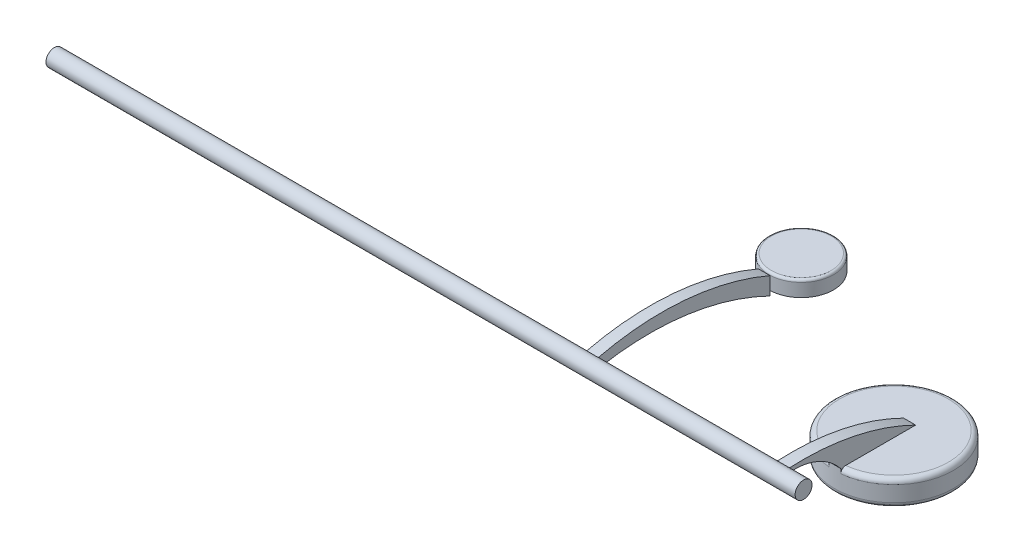
ISO-10303-21;
HEADER;
FILE_DESCRIPTION(('STEP AP214'),'2;1');
FILE_NAME('part.step','',(''),(''),'','','');
FILE_SCHEMA(('AUTOMOTIVE_DESIGN { 1 0 10303 214 1 1 1 1 }'));
ENDSEC;
DATA;
#1=APPLICATION_CONTEXT('core data for automotive mechanical design processes');
#2=APPLICATION_PROTOCOL_DEFINITION('international standard','automotive_design',2000,#1);
#3=PRODUCT_CONTEXT('',#1,'mechanical');
#4=PRODUCT('Part','Part','',(#3));
#5=PRODUCT_RELATED_PRODUCT_CATEGORY('part','',(#4));
#6=PRODUCT_DEFINITION_FORMATION('','',#4);
#7=PRODUCT_DEFINITION_CONTEXT('part definition',#1,'design');
#8=PRODUCT_DEFINITION('design','',#6,#7);
#9=PRODUCT_DEFINITION_SHAPE('','',#8);
#10=(LENGTH_UNIT() NAMED_UNIT(*) SI_UNIT(.MILLI.,.METRE.));
#11=(NAMED_UNIT(*) PLANE_ANGLE_UNIT() SI_UNIT($,.RADIAN.));
#12=(NAMED_UNIT(*) SI_UNIT($,.STERADIAN.) SOLID_ANGLE_UNIT());
#13=UNCERTAINTY_MEASURE_WITH_UNIT(LENGTH_MEASURE(1.E-05),#10,'distance_accuracy_value','');
#14=(GEOMETRIC_REPRESENTATION_CONTEXT(3) GLOBAL_UNCERTAINTY_ASSIGNED_CONTEXT((#13)) GLOBAL_UNIT_ASSIGNED_CONTEXT((#10,
#11,#12)) REPRESENTATION_CONTEXT('',''));
#15=CARTESIAN_POINT('',(0.,0.,0.));
#16=DIRECTION('',(0.,0.,1.));
#17=DIRECTION('',(1.,0.,0.));
#18=AXIS2_PLACEMENT_3D('',#15,#16,#17);
#19=CARTESIAN_POINT('',(140.0302,-6.80720000000001,-56.2092159368474));
#20=DIRECTION('',(0.,-1.,0.));
#21=DIRECTION('',(0.,0.,-1.));
#22=AXIS2_PLACEMENT_3D('',#19,#20,#21);
#23=CYLINDRICAL_SURFACE('',#22,8.4836);
#24=CARTESIAN_POINT('',(140.0302,-3.34367027846591,-56.2092159368474));
#25=DIRECTION('',(0.,1.,0.));
#26=DIRECTION('',(0.,0.,1.));
#27=AXIS2_PLACEMENT_3D('',#24,#25,#26);
#28=CIRCLE('',#27,8.4836);
#29=CARTESIAN_POINT('',(140.0302,-3.34367027846591,-47.7256159368473));
#30=VERTEX_POINT('',#29);
#31=EDGE_CURVE('E54',#30,#30,#28,.F.);
#32=ORIENTED_EDGE('',*,*,#31,.T.);
#33=EDGE_LOOP('',(#32));
#34=FACE_BOUND('',#33,.T.);
#35=CARTESIAN_POINT('',(140.0302,-6.80720000000001,-56.2092159368474));
#36=DIRECTION('',(0.,-1.,0.));
#37=DIRECTION('',(0.,0.,-1.));
#38=AXIS2_PLACEMENT_3D('',#35,#36,#37);
#39=CIRCLE('',#38,8.4836);
#40=CARTESIAN_POINT('',(140.0302,-6.80720000000001,-64.6928159368474));
#41=VERTEX_POINT('',#40);
#42=EDGE_CURVE('E58',#41,#41,#39,.T.);
#43=ORIENTED_EDGE('',*,*,#42,.F.);
#44=EDGE_LOOP('',(#43));
#45=FACE_BOUND('',#44,.T.);
#46=ADVANCED_FACE('F47',(#34,#45),#23,.T.);
#47=CARTESIAN_POINT('',(140.0302,-2.70867027846591,-47.7256159368473));
#48=DIRECTION('',(0.,1.,0.));
#49=DIRECTION('',(0.,0.,1.));
#50=AXIS2_PLACEMENT_3D('',#47,#48,#49);
#51=PLANE('',#50);
#52=CARTESIAN_POINT('',(140.0302,-2.70867027846591,-56.2092159368474));
#53=DIRECTION('',(0.,1.,0.));
#54=DIRECTION('',(0.,0.,1.));
#55=AXIS2_PLACEMENT_3D('',#52,#53,#54);
#56=CIRCLE('',#55,7.8486);
#57=CARTESIAN_POINT('',(140.0302,-2.70867027846591,-48.3606159368473));
#58=VERTEX_POINT('',#57);
#59=EDGE_CURVE('E11',#58,#58,#56,.T.);
#60=ORIENTED_EDGE('',*,*,#59,.T.);
#61=EDGE_LOOP('',(#60));
#62=FACE_BOUND('',#61,.T.);
#63=ADVANCED_FACE('F68',(#62),#51,.T.);
#64=CARTESIAN_POINT('',(140.0302,-6.80720000000001,-47.7256159368473));
#65=DIRECTION('',(0.,-1.,0.));
#66=DIRECTION('',(0.,0.,-1.));
#67=AXIS2_PLACEMENT_3D('',#64,#65,#66);
#68=PLANE('',#67);
#69=ORIENTED_EDGE('',*,*,#42,.T.);
#70=EDGE_LOOP('',(#69));
#71=FACE_BOUND('',#70,.T.);
#72=ADVANCED_FACE('F65',(#71),#68,.T.);
#73=CARTESIAN_POINT('',(140.0302,-3.34367027846591,-56.2092159368474));
#74=DIRECTION('',(0.,1.,0.));
#75=DIRECTION('',(0.,0.,1.));
#76=AXIS2_PLACEMENT_3D('',#73,#74,#75);
#77=TOROIDAL_SURFACE('',#76,7.8486,0.635);
#78=ORIENTED_EDGE('',*,*,#59,.F.);
#79=EDGE_LOOP('',(#78));
#80=FACE_BOUND('',#79,.T.);
#81=ORIENTED_EDGE('',*,*,#31,.F.);
#82=EDGE_LOOP('',(#81));
#83=FACE_BOUND('',#82,.T.);
#84=ADVANCED_FACE('F49',(#80,#83),#77,.T.);
#85=CLOSED_SHELL('',(#46,#63,#72,#84));
#86=MANIFOLD_SOLID_BREP('B2',#85);
#87=CARTESIAN_POINT('',(188.1378,-5.5372,-15.24));
#88=DIRECTION('',(0.,-1.,0.));
#89=DIRECTION('',(0.,0.,-1.));
#90=AXIS2_PLACEMENT_3D('',#87,#88,#89);
#91=PLANE('',#90);
#92=DIRECTION('',(0.,0.,-1.));
#93=VECTOR('',#92,1.);
#94=CARTESIAN_POINT('',(188.1378,-5.5372,-15.24));
#95=LINE('',#94,#93);
#96=CARTESIAN_POINT('',(188.1378,-5.5372,-15.24));
#97=VERTEX_POINT('',#96);
#98=CARTESIAN_POINT('',(188.1378,-5.5372,-15.3208750085464));
#99=VERTEX_POINT('',#98);
#100=EDGE_CURVE('E236',#97,#99,#95,.T.);
#101=ORIENTED_EDGE('',*,*,#100,.T.);
#102=CARTESIAN_POINT('',(189.7253,-5.5372,-30.861));
#103=DIRECTION('',(0.,-1.,0.));
#104=DIRECTION('',(0.,0.,-1.));
#105=AXIS2_PLACEMENT_3D('',#102,#103,#104);
#106=CIRCLE('',#105,15.621);
#107=CARTESIAN_POINT('',(189.7253,-5.5372,-15.24));
#108=VERTEX_POINT('',#107);
#109=EDGE_CURVE('E204',#108,#99,#106,.T.);
#110=ORIENTED_EDGE('',*,*,#109,.F.);
#111=DIRECTION('',(1.,0.,0.));
#112=VECTOR('',#111,1.);
#113=CARTESIAN_POINT('',(188.1378,-5.5372,-15.24));
#114=LINE('',#113,#112);
#115=EDGE_CURVE('E262',#97,#108,#114,.T.);
#116=ORIENTED_EDGE('',*,*,#115,.F.);
#117=EDGE_LOOP('',(#101,#110,#116));
#118=FACE_BOUND('',#117,.T.);
#119=ADVANCED_FACE('F103',(#118),#91,.T.);
#120=CARTESIAN_POINT('',(196.85,0.,0.));
#121=DIRECTION('',(-1.,0.,0.));
#122=DIRECTION('',(0.,0.,1.));
#123=AXIS2_PLACEMENT_3D('',#120,#121,#122);
#124=CYLINDRICAL_SURFACE('',#123,2.2225);
#125=DIRECTION('',(1.,0.,0.));
#126=VECTOR('',#125,1.);
#127=CARTESIAN_POINT('',(140.0302,1.76515248022416,-1.35046028137022));
#128=LINE('',#127,#126);
#129=CARTESIAN_POINT('',(138.5062,1.76515248022414,-1.35046028137022));
#130=VERTEX_POINT('',#129);
#131=CARTESIAN_POINT('',(141.5542,1.76515248022417,-1.35046028137027));
#132=VERTEX_POINT('',#131);
#133=EDGE_CURVE('E122',#130,#132,#128,.T.);
#134=ORIENTED_EDGE('',*,*,#133,.F.);
#135=CARTESIAN_POINT('',(138.5062,0.,0.));
#136=DIRECTION('',(-1.,0.,0.));
#137=DIRECTION('',(0.,0.,1.));
#138=AXIS2_PLACEMENT_3D('',#135,#136,#137);
#139=CIRCLE('',#138,2.2225);
#140=CARTESIAN_POINT('',(138.5062,-0.617883716154621,-2.13488312638208));
#141=VERTEX_POINT('',#140);
#142=EDGE_CURVE('E45',#130,#141,#139,.T.);
#143=ORIENTED_EDGE('',*,*,#142,.T.);
#144=DIRECTION('',(1.,0.,0.));
#145=VECTOR('',#144,1.);
#146=CARTESIAN_POINT('',(140.0302,-0.617883716154621,-2.13488312638209));
#147=LINE('',#146,#145);
#148=CARTESIAN_POINT('',(141.5542,-0.617883716154635,-2.13488312638203));
#149=VERTEX_POINT('',#148);
#150=EDGE_CURVE('E112',#149,#141,#147,.F.);
#151=ORIENTED_EDGE('',*,*,#150,.F.);
#152=CARTESIAN_POINT('',(141.5542,0.,0.));
#153=DIRECTION('',(-1.,0.,0.));
#154=DIRECTION('',(0.,0.,1.));
#155=AXIS2_PLACEMENT_3D('',#152,#153,#154);
#156=CIRCLE('',#155,2.2225);
#157=EDGE_CURVE('E380',#132,#149,#156,.T.);
#158=ORIENTED_EDGE('',*,*,#157,.F.);
#159=EDGE_LOOP('',(#134,#143,#151,#158));
#160=FACE_BOUND('',#159,.T.);
#161=DIRECTION('',(1.,0.,0.));
#162=VECTOR('',#161,1.);
#163=CARTESIAN_POINT('',(189.7253,1.29557688585347,-1.80582025208553));
#164=LINE('',#163,#162);
#165=CARTESIAN_POINT('',(191.3128,1.29557688585345,-1.80582025208543));
#166=VERTEX_POINT('',#165);
#167=CARTESIAN_POINT('',(188.1378,1.29557688585345,-1.80582025208553));
#168=VERTEX_POINT('',#167);
#169=EDGE_CURVE('E277',#166,#168,#164,.F.);
#170=ORIENTED_EDGE('',*,*,#169,.T.);
#171=CARTESIAN_POINT('',(188.1378,0.,0.));
#172=DIRECTION('',(-1.,0.,0.));
#173=DIRECTION('',(0.,0.,1.));
#174=AXIS2_PLACEMENT_3D('',#171,#172,#173);
#175=CIRCLE('',#174,2.2225);
#176=CARTESIAN_POINT('',(188.1378,0.290668192770734,-2.20341059535244));
#177=VERTEX_POINT('',#176);
#178=EDGE_CURVE('E283',#168,#177,#175,.T.);
#179=ORIENTED_EDGE('',*,*,#178,.T.);
#180=DIRECTION('',(1.,0.,0.));
#181=VECTOR('',#180,1.);
#182=CARTESIAN_POINT('',(189.7253,0.290668192770736,-2.20341059535244));
#183=LINE('',#182,#181);
#184=CARTESIAN_POINT('',(191.3128,0.290668192770734,-2.20341059535245));
#185=VERTEX_POINT('',#184);
#186=EDGE_CURVE('E280',#177,#185,#183,.T.);
#187=ORIENTED_EDGE('',*,*,#186,.T.);
#188=CARTESIAN_POINT('',(191.3128,0.,0.));
#189=DIRECTION('',(-1.,0.,0.));
#190=DIRECTION('',(0.,0.,1.));
#191=AXIS2_PLACEMENT_3D('',#188,#189,#190);
#192=CIRCLE('',#191,2.2225);
#193=EDGE_CURVE('E270',#166,#185,#192,.T.);
#194=ORIENTED_EDGE('',*,*,#193,.F.);
#195=EDGE_LOOP('',(#170,#179,#187,#194));
#196=FACE_BOUND('',#195,.T.);
#197=CARTESIAN_POINT('',(196.85,0.,0.));
#198=DIRECTION('',(1.,0.,0.));
#199=DIRECTION('',(0.,0.,-1.));
#200=AXIS2_PLACEMENT_3D('',#197,#198,#199);
#201=CIRCLE('',#200,2.2225);
#202=CARTESIAN_POINT('',(196.85,0.,-2.2225));
#203=VERTEX_POINT('',#202);
#204=EDGE_CURVE('E266',#203,#203,#201,.T.);
#205=ORIENTED_EDGE('',*,*,#204,.F.);
#206=EDGE_LOOP('',(#205));
#207=FACE_BOUND('',#206,.T.);
#208=CARTESIAN_POINT('',(0.,0.,0.));
#209=DIRECTION('',(1.,0.,0.));
#210=DIRECTION('',(0.,0.,-1.));
#211=AXIS2_PLACEMENT_3D('',#208,#209,#210);
#212=CIRCLE('',#211,2.2225);
#213=CARTESIAN_POINT('',(0.,0.,-2.2225));
#214=VERTEX_POINT('',#213);
#215=EDGE_CURVE('E261',#214,#214,#212,.T.);
#216=ORIENTED_EDGE('',*,*,#215,.T.);
#217=EDGE_LOOP('',(#216));
#218=FACE_BOUND('',#217,.T.);
#219=ADVANCED_FACE('F332',(#160,#196,#207,#218),#124,.T.);
#220=CARTESIAN_POINT('',(196.85,0.,0.));
#221=DIRECTION('',(1.,0.,0.));
#222=DIRECTION('',(0.,0.,-1.));
#223=AXIS2_PLACEMENT_3D('',#220,#221,#222);
#224=PLANE('',#223);
#225=ORIENTED_EDGE('',*,*,#204,.T.);
#226=EDGE_LOOP('',(#225));
#227=FACE_BOUND('',#226,.T.);
#228=ADVANCED_FACE('F336',(#227),#224,.T.);
#229=CARTESIAN_POINT('',(0.,0.,0.));
#230=DIRECTION('',(1.,0.,0.));
#231=DIRECTION('',(0.,0.,-1.));
#232=AXIS2_PLACEMENT_3D('',#229,#230,#231);
#233=PLANE('',#232);
#234=ORIENTED_EDGE('',*,*,#215,.F.);
#235=EDGE_LOOP('',(#234));
#236=FACE_BOUND('',#235,.T.);
#237=ADVANCED_FACE('F337',(#236),#233,.F.);
#238=CARTESIAN_POINT('',(188.1378,-15.1540357160565,-3.11995835649946));
#239=DIRECTION('',(1.,0.,0.));
#240=DIRECTION('',(0.,0.,-1.));
#241=AXIS2_PLACEMENT_3D('',#238,#239,#240);
#242=CYLINDRICAL_SURFACE('',#241,15.4718757308158);
#243=ORIENTED_EDGE('',*,*,#186,.F.);
#244=CARTESIAN_POINT('',(188.1378,-15.1540357160565,-3.11995835649946));
#245=DIRECTION('',(-1.,0.,0.));
#246=DIRECTION('',(0.,0.,1.));
#247=AXIS2_PLACEMENT_3D('',#244,#245,#246);
#248=CIRCLE('',#247,15.4718757308158);
#249=EDGE_CURVE('E233',#177,#97,#248,.T.);
#250=ORIENTED_EDGE('',*,*,#249,.T.);
#251=ORIENTED_EDGE('',*,*,#115,.T.);
#252=CARTESIAN_POINT('',(191.3128,-5.5372,-15.24));
#253=VERTEX_POINT('',#252);
#254=EDGE_CURVE('E245',#108,#253,#114,.T.);
#255=ORIENTED_EDGE('',*,*,#254,.T.);
#256=CARTESIAN_POINT('',(191.3128,-15.1540357160565,-3.11995835649946));
#257=DIRECTION('',(-1.,0.,0.));
#258=DIRECTION('',(0.,0.,1.));
#259=AXIS2_PLACEMENT_3D('',#256,#257,#258);
#260=CIRCLE('',#259,15.4718757308158);
#261=EDGE_CURVE('E232',#185,#253,#260,.T.);
#262=ORIENTED_EDGE('',*,*,#261,.F.);
#263=EDGE_LOOP('',(#243,#250,#251,#255,#262));
#264=FACE_BOUND('',#263,.T.);
#265=ADVANCED_FACE('F340',(#264),#242,.F.);
#266=CARTESIAN_POINT('',(188.1378,-65.5013953741166,-5.33486642610065));
#267=DIRECTION('',(1.,0.,0.));
#268=DIRECTION('',(0.,0.,-1.));
#269=AXIS2_PLACEMENT_3D('',#266,#267,#268);
#270=CYLINDRICAL_SURFACE('',#269,66.8901313348804);
#271=ORIENTED_EDGE('',*,*,#169,.F.);
#272=CARTESIAN_POINT('',(191.3128,-65.5013953741166,-5.33486642610065));
#273=DIRECTION('',(1.,0.,0.));
#274=DIRECTION('',(0.,0.,1.));
#275=AXIS2_PLACEMENT_3D('',#272,#273,#274);
#276=CIRCLE('',#275,66.8901313348804);
#277=CARTESIAN_POINT('',(191.3128,-5.5372,-34.9758));
#278=VERTEX_POINT('',#277);
#279=EDGE_CURVE('E237',#278,#166,#276,.T.);
#280=ORIENTED_EDGE('',*,*,#279,.F.);
#281=DIRECTION('',(1.,0.,0.));
#282=VECTOR('',#281,1.);
#283=CARTESIAN_POINT('',(188.1378,-5.5372,-34.9758));
#284=LINE('',#283,#282);
#285=CARTESIAN_POINT('',(188.1378,-5.5372,-34.9758));
#286=VERTEX_POINT('',#285);
#287=EDGE_CURVE('E257',#286,#278,#284,.T.);
#288=ORIENTED_EDGE('',*,*,#287,.F.);
#289=CARTESIAN_POINT('',(188.1378,-65.5013953741166,-5.33486642610065));
#290=DIRECTION('',(1.,0.,0.));
#291=DIRECTION('',(0.,0.,1.));
#292=AXIS2_PLACEMENT_3D('',#289,#290,#291);
#293=CIRCLE('',#292,66.8901313348804);
#294=EDGE_CURVE('E241',#286,#168,#293,.T.);
#295=ORIENTED_EDGE('',*,*,#294,.T.);
#296=EDGE_LOOP('',(#271,#280,#288,#295));
#297=FACE_BOUND('',#296,.T.);
#298=ADVANCED_FACE('F347',(#297),#270,.T.);
#299=ORIENTED_EDGE('',*,*,#254,.F.);
#300=CARTESIAN_POINT('',(191.3128,-5.5372,-15.3208750085464));
#301=VERTEX_POINT('',#300);
#302=EDGE_CURVE('E225',#301,#108,#106,.T.);
#303=ORIENTED_EDGE('',*,*,#302,.F.);
#304=DIRECTION('',(0.,0.,-1.));
#305=VECTOR('',#304,1.);
#306=CARTESIAN_POINT('',(191.3128,-5.5372,-15.24));
#307=LINE('',#306,#305);
#308=EDGE_CURVE('E250',#253,#301,#307,.T.);
#309=ORIENTED_EDGE('',*,*,#308,.F.);
#310=EDGE_LOOP('',(#299,#303,#309));
#311=FACE_BOUND('',#310,.T.);
#312=ADVANCED_FACE('F349',(#311),#91,.T.);
#313=CARTESIAN_POINT('',(188.1378,-15.1540357160565,-3.11995835649946));
#314=DIRECTION('',(-1.,0.,0.));
#315=DIRECTION('',(0.,0.,1.));
#316=AXIS2_PLACEMENT_3D('',#313,#314,#315);
#317=PLANE('',#316);
#318=ORIENTED_EDGE('',*,*,#178,.F.);
#319=ORIENTED_EDGE('',*,*,#294,.F.);
#320=DIRECTION('',(0.,0.,1.));
#321=VECTOR('',#320,1.);
#322=CARTESIAN_POINT('',(188.1378,-5.5372,-3.11995835649946));
#323=LINE('',#322,#321);
#324=CARTESIAN_POINT('',(188.1378,-5.5372,-16.5980744673472));
#325=VERTEX_POINT('',#324);
#326=EDGE_CURVE('E228',#286,#325,#323,.T.);
#327=ORIENTED_EDGE('',*,*,#326,.T.);
#328=CARTESIAN_POINT('',(188.1378,-5.5372,-16.5980744673472));
#329=CARTESIAN_POINT('',(188.1378,-5.53720035402752,-16.5619845945209));
#330=CARTESIAN_POINT('',(188.1378,-5.53872048462792,-16.5259118928654));
#331=CARTESIAN_POINT('',(188.1378,-5.54478653251007,-16.4540230182292));
#332=CARTESIAN_POINT('',(188.1378,-5.54933235452245,-16.4182068372073));
#333=CARTESIAN_POINT('',(188.1378,-5.56747014501665,-16.3115770219959));
#334=CARTESIAN_POINT('',(188.1378,-5.585562532165,-16.2414752235881));
#335=CARTESIAN_POINT('',(188.1378,-5.63326974178641,-16.1053027984621));
#336=CARTESIAN_POINT('',(188.1378,-5.66289102180745,-16.0392344549921));
#337=CARTESIAN_POINT('',(188.1378,-5.73283484927241,-15.913034973679));
#338=CARTESIAN_POINT('',(188.1378,-5.7731548863264,-15.8529024475725));
#339=CARTESIAN_POINT('',(188.1378,-5.86322968894011,-15.7404876342223));
#340=CARTESIAN_POINT('',(188.1378,-5.91295464597464,-15.6881814552683));
#341=CARTESIAN_POINT('',(188.1378,-6.0205355340755,-15.5927032890186));
#342=CARTESIAN_POINT('',(188.1378,-6.0783929832679,-15.549533010938));
#343=CARTESIAN_POINT('',(188.1378,-6.20025521963751,-15.4738079436794));
#344=CARTESIAN_POINT('',(188.1378,-6.26422642407535,-15.441199042785));
#345=CARTESIAN_POINT('',(188.1378,-6.39673855393669,-15.3872588476006));
#346=CARTESIAN_POINT('',(188.1378,-6.46527642158366,-15.3659200907561));
#347=CARTESIAN_POINT('',(188.1378,-6.57975862950294,-15.3406705136492));
#348=CARTESIAN_POINT('',(188.1378,-6.62495969554166,-15.3332515694816));
#349=CARTESIAN_POINT('',(188.1378,-6.71583394105361,-15.3233547053053));
#350=CARTESIAN_POINT('',(188.1378,-6.76150635251128,-15.3208697310263));
#351=CARTESIAN_POINT('',(188.1378,-6.8072,-15.3208750085464));
#352=B_SPLINE_CURVE_WITH_KNOTS('',3,(#328,#329,#330,#331,#332,#333,#334,#335,#336,#337,#338,
#339,#340,#341,#342,#343,#344,#345,#346,#347,#348,#349,#350,#351),.UNSPECIFIED.,.F.,.F.,(4,2,2,
2,2,2,2,2,2,2,2,4),(0.,0.108203434440759,0.216403462061916,0.432486909265101,0.648691563423035,
0.864845531434343,1.08032555249805,1.29584585166497,1.51024378113154,1.72449956791425,
1.86166785065992,1.99863987746261),.UNSPECIFIED.);
#353=CARTESIAN_POINT('',(188.1378,-6.8072,-15.3208750085464));
#354=VERTEX_POINT('',#353);
#355=EDGE_CURVE('E316',#325,#354,#352,.T.);
#356=ORIENTED_EDGE('',*,*,#355,.T.);
#357=DIRECTION('',(0.,1.,0.));
#358=VECTOR('',#357,1.);
#359=CARTESIAN_POINT('',(188.1378,-5.5372,-15.3208750085464));
#360=LINE('',#359,#358);
#361=EDGE_CURVE('E290',#99,#354,#360,.F.);
#362=ORIENTED_EDGE('',*,*,#361,.F.);
#363=ORIENTED_EDGE('',*,*,#100,.F.);
#364=ORIENTED_EDGE('',*,*,#249,.F.);
#365=EDGE_LOOP('',(#318,#319,#327,#356,#362,#363,#364));
#366=FACE_BOUND('',#365,.T.);
#367=ADVANCED_FACE('F351',(#366),#317,.T.);
#368=CARTESIAN_POINT('',(191.3128,-15.1540357160565,-3.11995835649946));
#369=DIRECTION('',(-1.,0.,0.));
#370=DIRECTION('',(0.,0.,1.));
#371=AXIS2_PLACEMENT_3D('',#368,#369,#370);
#372=PLANE('',#371);
#373=ORIENTED_EDGE('',*,*,#279,.T.);
#374=ORIENTED_EDGE('',*,*,#193,.T.);
#375=ORIENTED_EDGE('',*,*,#261,.T.);
#376=ORIENTED_EDGE('',*,*,#308,.T.);
#377=DIRECTION('',(0.,1.,0.));
#378=VECTOR('',#377,1.);
#379=CARTESIAN_POINT('',(191.3128,-6.8072,-15.3208750085464));
#380=LINE('',#379,#378);
#381=CARTESIAN_POINT('',(191.3128,-6.8072,-15.3208750085464));
#382=VERTEX_POINT('',#381);
#383=EDGE_CURVE('E298',#382,#301,#380,.T.);
#384=ORIENTED_EDGE('',*,*,#383,.F.);
#385=CARTESIAN_POINT('',(191.3128,-6.8072,-15.3208750085464));
#386=CARTESIAN_POINT('',(191.3128,-6.77160658395204,-15.320875155838));
#387=CARTESIAN_POINT('',(191.3128,-6.73603026313797,-15.3223800757));
#388=CARTESIAN_POINT('',(191.3128,-6.66513316453102,-15.3283832012019));
#389=CARTESIAN_POINT('',(191.3128,-6.62981237215023,-15.3328812345822));
#390=CARTESIAN_POINT('',(191.3128,-6.52468452819255,-15.3508194808224));
#391=CARTESIAN_POINT('',(191.3128,-6.45558322268854,-15.3687039749307));
#392=CARTESIAN_POINT('',(191.3128,-6.3213684173406,-15.4158143874093));
#393=CARTESIAN_POINT('',(191.3128,-6.25625665869075,-15.445045217512));
#394=CARTESIAN_POINT('',(191.3128,-6.13185036163748,-15.5139980194144));
#395=CARTESIAN_POINT('',(191.3128,-6.07255502488122,-15.5537185486434));
#396=CARTESIAN_POINT('',(191.3128,-5.96131908683474,-15.6426038595838));
#397=CARTESIAN_POINT('',(191.3128,-5.90939464167833,-15.6917888473449));
#398=CARTESIAN_POINT('',(191.3128,-5.8144804369427,-15.7981506153649));
#399=CARTESIAN_POINT('',(191.3128,-5.77149248039756,-15.8553290044952));
#400=CARTESIAN_POINT('',(191.3128,-5.69544864202536,-15.9763513615785));
#401=CARTESIAN_POINT('',(191.3128,-5.66244489206246,-16.0402280479128));
#402=CARTESIAN_POINT('',(191.3128,-5.60758040393519,-16.1725848115714));
#403=CARTESIAN_POINT('',(191.3128,-5.58571412945969,-16.2410625825495));
#404=CARTESIAN_POINT('',(191.3128,-5.55890315567117,-16.3579434628321));
#405=CARTESIAN_POINT('',(191.3128,-5.55076881123346,-16.4056400498642));
#406=CARTESIAN_POINT('',(191.3128,-5.53991777474698,-16.5015763295737));
#407=CARTESIAN_POINT('',(191.3128,-5.53719334910788,-16.5498151476996));
#408=CARTESIAN_POINT('',(191.3128,-5.5372,-16.5980744673472));
#409=B_SPLINE_CURVE_WITH_KNOTS('',3,(#385,#386,#387,#388,#389,#390,#391,#392,#393,#394,#395,
#396,#397,#398,#399,#400,#401,#402,#403,#404,#405,#406,#407,#408),.UNSPECIFIED.,.F.,.F.,(4,2,2,
2,2,2,2,2,2,2,2,4),(0.,0.106714511386054,0.213422881676475,0.426458189632693,0.6395858217972,
0.852684159346274,1.06624260050166,1.27984408767349,1.49454235968186,1.70913380323376,
1.85400215255446,1.99866326007107),.UNSPECIFIED.);
#410=CARTESIAN_POINT('',(191.3128,-5.5372,-16.5980744673472));
#411=VERTEX_POINT('',#410);
#412=EDGE_CURVE('E308',#382,#411,#409,.T.);
#413=ORIENTED_EDGE('',*,*,#412,.T.);
#414=EDGE_CURVE('E249',#411,#278,#307,.T.);
#415=ORIENTED_EDGE('',*,*,#414,.T.);
#416=EDGE_LOOP('',(#373,#374,#375,#376,#384,#413,#415));
#417=FACE_BOUND('',#416,.T.);
#418=ADVANCED_FACE('F323',(#417),#372,.F.);
#419=CARTESIAN_POINT('',(189.7253,-12.192,-30.861));
#420=DIRECTION('',(0.,1.,0.));
#421=DIRECTION('',(0.,0.,1.));
#422=AXIS2_PLACEMENT_3D('',#419,#420,#421);
#423=CYLINDRICAL_SURFACE('',#422,15.621);
#424=CARTESIAN_POINT('',(189.7253,-10.922,-30.861));
#425=DIRECTION('',(0.,-1.,0.));
#426=DIRECTION('',(0.,0.,-1.));
#427=AXIS2_PLACEMENT_3D('',#424,#425,#426);
#428=CIRCLE('',#427,15.621);
#429=CARTESIAN_POINT('',(189.7253,-10.922,-46.482));
#430=VERTEX_POINT('',#429);
#431=EDGE_CURVE('E286',#430,#430,#428,.F.);
#432=ORIENTED_EDGE('',*,*,#431,.T.);
#433=EDGE_LOOP('',(#432));
#434=FACE_BOUND('',#433,.T.);
#435=CARTESIAN_POINT('',(189.7253,-6.8072,-30.861));
#436=DIRECTION('',(0.,-1.,0.));
#437=DIRECTION('',(0.,0.,-1.));
#438=AXIS2_PLACEMENT_3D('',#435,#436,#437);
#439=CIRCLE('',#438,15.621);
#440=EDGE_CURVE('E294',#354,#382,#439,.T.);
#441=ORIENTED_EDGE('',*,*,#440,.T.);
#442=ORIENTED_EDGE('',*,*,#383,.T.);
#443=ORIENTED_EDGE('',*,*,#302,.T.);
#444=ORIENTED_EDGE('',*,*,#109,.T.);
#445=ORIENTED_EDGE('',*,*,#361,.T.);
#446=EDGE_LOOP('',(#441,#442,#443,#444,#445));
#447=FACE_BOUND('',#446,.T.);
#448=ADVANCED_FACE('F373',(#434,#447),#423,.T.);
#449=CARTESIAN_POINT('',(189.7253,-12.192,-30.861));
#450=DIRECTION('',(0.,-1.,0.));
#451=DIRECTION('',(0.,0.,-1.));
#452=AXIS2_PLACEMENT_3D('',#449,#450,#451);
#453=PLANE('',#452);
#454=CARTESIAN_POINT('',(189.7253,-12.192,-30.861));
#455=DIRECTION('',(0.,-1.,0.));
#456=DIRECTION('',(0.,0.,-1.));
#457=AXIS2_PLACEMENT_3D('',#454,#455,#456);
#458=CIRCLE('',#457,14.351);
#459=CARTESIAN_POINT('',(189.7253,-12.192,-45.212));
#460=VERTEX_POINT('',#459);
#461=EDGE_CURVE('E304',#460,#460,#458,.T.);
#462=ORIENTED_EDGE('',*,*,#461,.T.);
#463=EDGE_LOOP('',(#462));
#464=FACE_BOUND('',#463,.T.);
#465=ADVANCED_FACE('F405',(#464),#453,.T.);
#466=CARTESIAN_POINT('',(189.7253,-5.5372,-30.861));
#467=DIRECTION('',(0.,-1.,0.));
#468=DIRECTION('',(0.,0.,-1.));
#469=AXIS2_PLACEMENT_3D('',#466,#467,#468);
#470=PLANE('',#469);
#471=ORIENTED_EDGE('',*,*,#414,.F.);
#472=CARTESIAN_POINT('',(189.7253,-5.5372,-30.861));
#473=DIRECTION('',(0.,-1.,0.));
#474=DIRECTION('',(0.,0.,-1.));
#475=AXIS2_PLACEMENT_3D('',#472,#473,#474);
#476=CIRCLE('',#475,14.351);
#477=EDGE_CURVE('E301',#411,#325,#476,.F.);
#478=ORIENTED_EDGE('',*,*,#477,.T.);
#479=ORIENTED_EDGE('',*,*,#326,.F.);
#480=ORIENTED_EDGE('',*,*,#287,.T.);
#481=EDGE_LOOP('',(#471,#478,#479,#480));
#482=FACE_BOUND('',#481,.T.);
#483=ADVANCED_FACE('F330',(#482),#470,.F.);
#484=CARTESIAN_POINT('',(189.7253,-6.8072,-30.861));
#485=DIRECTION('',(0.,-1.,0.));
#486=DIRECTION('',(0.,0.,-1.));
#487=AXIS2_PLACEMENT_3D('',#484,#485,#486);
#488=TOROIDAL_SURFACE('',#487,14.351,1.27);
#489=ORIENTED_EDGE('',*,*,#355,.F.);
#490=ORIENTED_EDGE('',*,*,#477,.F.);
#491=ORIENTED_EDGE('',*,*,#412,.F.);
#492=ORIENTED_EDGE('',*,*,#440,.F.);
#493=EDGE_LOOP('',(#489,#490,#491,#492));
#494=FACE_BOUND('',#493,.T.);
#495=ADVANCED_FACE('F326',(#494),#488,.T.);
#496=CARTESIAN_POINT('',(189.7253,-10.922,-30.861));
#497=DIRECTION('',(0.,-1.,0.));
#498=DIRECTION('',(0.,0.,-1.));
#499=AXIS2_PLACEMENT_3D('',#496,#497,#498);
#500=TOROIDAL_SURFACE('',#499,14.351,1.27);
#501=ORIENTED_EDGE('',*,*,#431,.F.);
#502=EDGE_LOOP('',(#501));
#503=FACE_BOUND('',#502,.T.);
#504=ORIENTED_EDGE('',*,*,#461,.F.);
#505=EDGE_LOOP('',(#504));
#506=FACE_BOUND('',#505,.T.);
#507=ADVANCED_FACE('F105',(#503,#506),#500,.T.);
#508=CARTESIAN_POINT('',(138.5062,-71.2694413414767,-14.8798462556243));
#509=DIRECTION('',(1.,0.,0.));
#510=DIRECTION('',(0.,0.,-1.));
#511=AXIS2_PLACEMENT_3D('',#508,#509,#510);
#512=CYLINDRICAL_SURFACE('',#511,71.7918984290703);
#513=CARTESIAN_POINT('',(141.5542,-71.2694413414767,-14.8798462556243));
#514=DIRECTION('',(1.,0.,0.));
#515=DIRECTION('',(0.,0.,1.));
#516=AXIS2_PLACEMENT_3D('',#513,#514,#515);
#517=CIRCLE('',#516,71.7918984290703);
#518=CARTESIAN_POINT('',(141.5542,-6.8072,-46.482));
#519=VERTEX_POINT('',#518);
#520=EDGE_CURVE('E216',#519,#149,#517,.T.);
#521=ORIENTED_EDGE('',*,*,#520,.T.);
#522=ORIENTED_EDGE('',*,*,#150,.T.);
#523=CARTESIAN_POINT('',(138.5062,-71.2694413414767,-14.8798462556243));
#524=DIRECTION('',(1.,0.,0.));
#525=DIRECTION('',(0.,0.,1.));
#526=AXIS2_PLACEMENT_3D('',#523,#524,#525);
#527=CIRCLE('',#526,71.7918984290703);
#528=CARTESIAN_POINT('',(138.5062,-6.8072,-46.482));
#529=VERTEX_POINT('',#528);
#530=EDGE_CURVE('E194',#529,#141,#527,.T.);
#531=ORIENTED_EDGE('',*,*,#530,.F.);
#532=DIRECTION('',(1.,0.,0.));
#533=VECTOR('',#532,1.);
#534=CARTESIAN_POINT('',(138.5062,-6.8072,-46.482));
#535=LINE('',#534,#533);
#536=EDGE_CURVE('E205',#529,#519,#535,.T.);
#537=ORIENTED_EDGE('',*,*,#536,.T.);
#538=EDGE_LOOP('',(#521,#522,#531,#537));
#539=FACE_BOUND('',#538,.T.);
#540=ADVANCED_FACE('F386',(#539),#512,.F.);
#541=CARTESIAN_POINT('',(138.5062,-68.2906058606023,-17.9955371359922));
#542=DIRECTION('',(1.,0.,0.));
#543=DIRECTION('',(0.,0.,-1.));
#544=AXIS2_PLACEMENT_3D('',#541,#542,#543);
#545=CYLINDRICAL_SURFACE('',#544,72.0060265547582);
#546=CARTESIAN_POINT('',(138.5062,-68.2906058606023,-17.9955371359922));
#547=DIRECTION('',(-1.,0.,0.));
#548=DIRECTION('',(0.,0.,1.));
#549=AXIS2_PLACEMENT_3D('',#546,#547,#548);
#550=CIRCLE('',#549,72.0060265547582);
#551=CARTESIAN_POINT('',(138.5062,-2.15899999999999,-46.482));
#552=VERTEX_POINT('',#551);
#553=EDGE_CURVE('E185',#130,#552,#550,.T.);
#554=ORIENTED_EDGE('',*,*,#553,.F.);
#555=ORIENTED_EDGE('',*,*,#133,.T.);
#556=CARTESIAN_POINT('',(141.5542,-68.2906058606023,-17.9955371359922));
#557=DIRECTION('',(-1.,0.,0.));
#558=DIRECTION('',(0.,0.,1.));
#559=AXIS2_PLACEMENT_3D('',#556,#557,#558);
#560=CIRCLE('',#559,72.0060265547582);
#561=CARTESIAN_POINT('',(141.5542,-2.15899999999999,-46.482));
#562=VERTEX_POINT('',#561);
#563=EDGE_CURVE('E200',#132,#562,#560,.T.);
#564=ORIENTED_EDGE('',*,*,#563,.T.);
#565=DIRECTION('',(1.,0.,0.));
#566=VECTOR('',#565,1.);
#567=CARTESIAN_POINT('',(138.5062,-2.15899999999999,-46.482));
#568=LINE('',#567,#566);
#569=EDGE_CURVE('E197',#552,#562,#568,.T.);
#570=ORIENTED_EDGE('',*,*,#569,.F.);
#571=EDGE_LOOP('',(#554,#555,#564,#570));
#572=FACE_BOUND('',#571,.T.);
#573=ADVANCED_FACE('F198',(#572),#545,.T.);
#574=CARTESIAN_POINT('',(138.5062,-6.8072,-46.482));
#575=DIRECTION('',(0.,0.,1.));
#576=DIRECTION('',(0.,-1.,0.));
#577=AXIS2_PLACEMENT_3D('',#574,#575,#576);
#578=PLANE('',#577);
#579=DIRECTION('',(0.,-1.,0.));
#580=VECTOR('',#579,1.);
#581=CARTESIAN_POINT('',(141.5542,-6.8072,-46.482));
#582=LINE('',#581,#580);
#583=EDGE_CURVE('E222',#562,#519,#582,.T.);
#584=ORIENTED_EDGE('',*,*,#583,.T.);
#585=ORIENTED_EDGE('',*,*,#536,.F.);
#586=DIRECTION('',(0.,-1.,0.));
#587=VECTOR('',#586,1.);
#588=CARTESIAN_POINT('',(138.5062,-6.8072,-46.482));
#589=LINE('',#588,#587);
#590=EDGE_CURVE('E190',#552,#529,#589,.T.);
#591=ORIENTED_EDGE('',*,*,#590,.F.);
#592=ORIENTED_EDGE('',*,*,#569,.T.);
#593=EDGE_LOOP('',(#584,#585,#591,#592));
#594=FACE_BOUND('',#593,.T.);
#595=ADVANCED_FACE('F207',(#594),#578,.F.);
#596=CARTESIAN_POINT('',(138.5062,-71.2694413414767,-14.8798462556243));
#597=DIRECTION('',(-1.,0.,0.));
#598=DIRECTION('',(0.,0.,1.));
#599=AXIS2_PLACEMENT_3D('',#596,#597,#598);
#600=PLANE('',#599);
#601=ORIENTED_EDGE('',*,*,#142,.F.);
#602=ORIENTED_EDGE('',*,*,#553,.T.);
#603=ORIENTED_EDGE('',*,*,#590,.T.);
#604=ORIENTED_EDGE('',*,*,#530,.T.);
#605=EDGE_LOOP('',(#601,#602,#603,#604));
#606=FACE_BOUND('',#605,.T.);
#607=ADVANCED_FACE('F187',(#606),#600,.T.);
#608=CARTESIAN_POINT('',(141.5542,-71.2694413414767,-14.8798462556243));
#609=DIRECTION('',(-1.,0.,0.));
#610=DIRECTION('',(0.,0.,1.));
#611=AXIS2_PLACEMENT_3D('',#608,#609,#610);
#612=PLANE('',#611);
#613=ORIENTED_EDGE('',*,*,#563,.F.);
#614=ORIENTED_EDGE('',*,*,#157,.T.);
#615=ORIENTED_EDGE('',*,*,#520,.F.);
#616=ORIENTED_EDGE('',*,*,#583,.F.);
#617=EDGE_LOOP('',(#613,#614,#615,#616));
#618=FACE_BOUND('',#617,.T.);
#619=ADVANCED_FACE('F391',(#618),#612,.F.);
#620=CLOSED_SHELL('',(#119,#219,#228,#237,#265,#298,#312,#367,#418,#448,#465,#483,#495,#507,
#540,#573,#595,#607,#619));
#621=MANIFOLD_SOLID_BREP('B6',#620);
#622=ADVANCED_BREP_SHAPE_REPRESENTATION('',(#18,#86,#621),#14);
#623=SHAPE_DEFINITION_REPRESENTATION(#9,#622);
ENDSEC;
END-ISO-10303-21;
